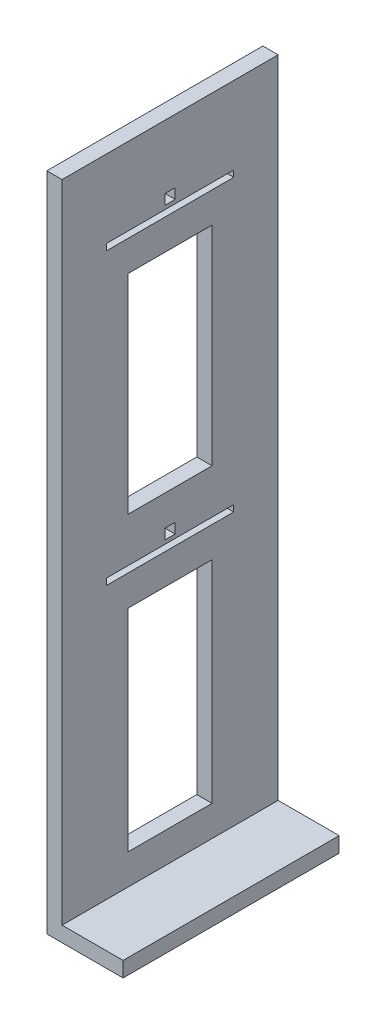
ISO-10303-21;
HEADER;
FILE_DESCRIPTION(('STEP AP214'),'2;1');
FILE_NAME('part.step','',(''),(''),'','','');
FILE_SCHEMA(('AUTOMOTIVE_DESIGN { 1 0 10303 214 1 1 1 1 }'));
ENDSEC;
DATA;
#1=APPLICATION_CONTEXT('core data for automotive mechanical design processes');
#2=APPLICATION_PROTOCOL_DEFINITION('international standard','automotive_design',2000,#1);
#3=PRODUCT_CONTEXT('',#1,'mechanical');
#4=PRODUCT('Part','Part','',(#3));
#5=PRODUCT_RELATED_PRODUCT_CATEGORY('part','',(#4));
#6=PRODUCT_DEFINITION_FORMATION('','',#4);
#7=PRODUCT_DEFINITION_CONTEXT('part definition',#1,'design');
#8=PRODUCT_DEFINITION('design','',#6,#7);
#9=PRODUCT_DEFINITION_SHAPE('','',#8);
#10=(LENGTH_UNIT() NAMED_UNIT(*) SI_UNIT(.MILLI.,.METRE.));
#11=(NAMED_UNIT(*) PLANE_ANGLE_UNIT() SI_UNIT($,.RADIAN.));
#12=(NAMED_UNIT(*) SI_UNIT($,.STERADIAN.) SOLID_ANGLE_UNIT());
#13=UNCERTAINTY_MEASURE_WITH_UNIT(LENGTH_MEASURE(1.E-05),#10,'distance_accuracy_value','');
#14=(GEOMETRIC_REPRESENTATION_CONTEXT(3) GLOBAL_UNCERTAINTY_ASSIGNED_CONTEXT((#13)) GLOBAL_UNIT_ASSIGNED_CONTEXT((#10,
#11,#12)) REPRESENTATION_CONTEXT('',''));
#15=CARTESIAN_POINT('',(0.,0.,0.));
#16=DIRECTION('',(0.,0.,1.));
#17=DIRECTION('',(1.,0.,0.));
#18=AXIS2_PLACEMENT_3D('',#15,#16,#17);
#19=CARTESIAN_POINT('',(-26.,1.2,-11.9444444444445));
#20=DIRECTION('',(1.,0.,0.));
#21=DIRECTION('',(0.,0.,-1.));
#22=AXIS2_PLACEMENT_3D('',#19,#20,#21);
#23=PLANE('',#22);
#24=DIRECTION('',(0.,0.,-1.));
#25=VECTOR('',#24,1.);
#26=CARTESIAN_POINT('',(-26.,43.,-0.144444444444462));
#27=LINE('',#26,#25);
#28=CARTESIAN_POINT('',(-26.,43.,-0.144444444444462));
#29=VERTEX_POINT('',#28);
#30=CARTESIAN_POINT('',(-26.,43.,-6.74444444444446));
#31=VERTEX_POINT('',#30);
#32=EDGE_CURVE('E267',#29,#31,#27,.T.);
#33=ORIENTED_EDGE('',*,*,#32,.F.);
#34=DIRECTION('',(0.,1.,0.));
#35=VECTOR('',#34,1.);
#36=CARTESIAN_POINT('',(-26.,43.,-0.144444444444462));
#37=LINE('',#36,#35);
#38=CARTESIAN_POINT('',(-26.,26.6,-0.144444444444464));
#39=VERTEX_POINT('',#38);
#40=EDGE_CURVE('E281',#39,#29,#37,.T.);
#41=ORIENTED_EDGE('',*,*,#40,.F.);
#42=DIRECTION('',(0.,0.,1.));
#43=VECTOR('',#42,1.);
#44=CARTESIAN_POINT('',(-26.,26.6,-0.144444444444464));
#45=LINE('',#44,#43);
#46=CARTESIAN_POINT('',(-26.,26.6,-6.74444444444446));
#47=VERTEX_POINT('',#46);
#48=EDGE_CURVE('E273',#47,#39,#45,.T.);
#49=ORIENTED_EDGE('',*,*,#48,.F.);
#50=DIRECTION('',(0.,-1.,0.));
#51=VECTOR('',#50,1.);
#52=CARTESIAN_POINT('',(-26.,43.,-6.74444444444446));
#53=LINE('',#52,#51);
#54=EDGE_CURVE('E264',#31,#47,#53,.T.);
#55=ORIENTED_EDGE('',*,*,#54,.F.);
#56=EDGE_LOOP('',(#33,#41,#49,#55));
#57=FACE_BOUND('',#56,.T.);
#58=DIRECTION('',(0.,0.,-1.));
#59=VECTOR('',#58,1.);
#60=CARTESIAN_POINT('',(-26.,20.2,-0.144444444444465));
#61=LINE('',#60,#59);
#62=CARTESIAN_POINT('',(-26.,20.2,-0.144444444444465));
#63=VERTEX_POINT('',#62);
#64=CARTESIAN_POINT('',(-26.,20.2,-6.74444444444447));
#65=VERTEX_POINT('',#64);
#66=EDGE_CURVE('E313',#63,#65,#61,.T.);
#67=ORIENTED_EDGE('',*,*,#66,.F.);
#68=DIRECTION('',(0.,1.,0.));
#69=VECTOR('',#68,1.);
#70=CARTESIAN_POINT('',(-26.,20.2,-0.144444444444465));
#71=LINE('',#70,#69);
#72=CARTESIAN_POINT('',(-26.,3.6,-0.144444444444467));
#73=VERTEX_POINT('',#72);
#74=EDGE_CURVE('E302',#73,#63,#71,.T.);
#75=ORIENTED_EDGE('',*,*,#74,.F.);
#76=DIRECTION('',(0.,0.,1.));
#77=VECTOR('',#76,1.);
#78=CARTESIAN_POINT('',(-26.,3.6,-0.144444444444467));
#79=LINE('',#78,#77);
#80=CARTESIAN_POINT('',(-26.,3.6,-6.74444444444447));
#81=VERTEX_POINT('',#80);
#82=EDGE_CURVE('E294',#81,#73,#79,.T.);
#83=ORIENTED_EDGE('',*,*,#82,.F.);
#84=DIRECTION('',(0.,-1.,0.));
#85=VECTOR('',#84,1.);
#86=CARTESIAN_POINT('',(-26.,20.2,-6.74444444444447));
#87=LINE('',#86,#85);
#88=EDGE_CURVE('E277',#65,#81,#87,.T.);
#89=ORIENTED_EDGE('',*,*,#88,.F.);
#90=EDGE_LOOP('',(#67,#75,#83,#89));
#91=FACE_BOUND('',#90,.T.);
#92=DIRECTION('',(0.,0.,1.));
#93=VECTOR('',#92,1.);
#94=CARTESIAN_POINT('',(-26.,46.2,-3.04444444444446));
#95=LINE('',#94,#93);
#96=CARTESIAN_POINT('',(-26.,46.2,-3.84444444444446));
#97=VERTEX_POINT('',#96);
#98=CARTESIAN_POINT('',(-26.,46.2,-3.04444444444446));
#99=VERTEX_POINT('',#98);
#100=EDGE_CURVE('E359',#97,#99,#95,.T.);
#101=ORIENTED_EDGE('',*,*,#100,.F.);
#102=DIRECTION('',(0.,-1.,0.));
#103=VECTOR('',#102,1.);
#104=CARTESIAN_POINT('',(-26.,46.2,-3.84444444444446));
#105=LINE('',#104,#103);
#106=CARTESIAN_POINT('',(-26.,47.,-3.84444444444446));
#107=VERTEX_POINT('',#106);
#108=EDGE_CURVE('E348',#107,#97,#105,.T.);
#109=ORIENTED_EDGE('',*,*,#108,.F.);
#110=DIRECTION('',(0.,0.,-1.));
#111=VECTOR('',#110,1.);
#112=CARTESIAN_POINT('',(-26.,47.,-3.04444444444446));
#113=LINE('',#112,#111);
#114=CARTESIAN_POINT('',(-26.,47.,-3.04444444444446));
#115=VERTEX_POINT('',#114);
#116=EDGE_CURVE('E340',#115,#107,#113,.T.);
#117=ORIENTED_EDGE('',*,*,#116,.F.);
#118=DIRECTION('',(0.,1.,0.));
#119=VECTOR('',#118,1.);
#120=CARTESIAN_POINT('',(-26.,46.2,-3.04444444444446));
#121=LINE('',#120,#119);
#122=EDGE_CURVE('E362',#99,#115,#121,.T.);
#123=ORIENTED_EDGE('',*,*,#122,.F.);
#124=EDGE_LOOP('',(#101,#109,#117,#123));
#125=FACE_BOUND('',#124,.T.);
#126=DIRECTION('',(0.,0.,-1.));
#127=VECTOR('',#126,1.);
#128=CARTESIAN_POINT('',(-26.,23.1,1.55555555555554));
#129=LINE('',#128,#127);
#130=CARTESIAN_POINT('',(-26.,23.1,1.55555555555554));
#131=VERTEX_POINT('',#130);
#132=CARTESIAN_POINT('',(-26.,23.1,-8.44444444444446));
#133=VERTEX_POINT('',#132);
#134=EDGE_CURVE('E382',#131,#133,#129,.T.);
#135=ORIENTED_EDGE('',*,*,#134,.F.);
#136=DIRECTION('',(0.,1.,0.));
#137=VECTOR('',#136,1.);
#138=CARTESIAN_POINT('',(-26.,23.1,1.55555555555554));
#139=LINE('',#138,#137);
#140=CARTESIAN_POINT('',(-26.,22.6,1.55555555555554));
#141=VERTEX_POINT('',#140);
#142=EDGE_CURVE('E371',#141,#131,#139,.T.);
#143=ORIENTED_EDGE('',*,*,#142,.F.);
#144=DIRECTION('',(0.,0.,1.));
#145=VECTOR('',#144,1.);
#146=CARTESIAN_POINT('',(-26.,22.6,1.55555555555554));
#147=LINE('',#146,#145);
#148=CARTESIAN_POINT('',(-26.,22.6,-8.44444444444446));
#149=VERTEX_POINT('',#148);
#150=EDGE_CURVE('E339',#149,#141,#147,.T.);
#151=ORIENTED_EDGE('',*,*,#150,.F.);
#152=DIRECTION('',(0.,-1.,0.));
#153=VECTOR('',#152,1.);
#154=CARTESIAN_POINT('',(-26.,23.1,-8.44444444444446));
#155=LINE('',#154,#153);
#156=EDGE_CURVE('E344',#133,#149,#155,.T.);
#157=ORIENTED_EDGE('',*,*,#156,.F.);
#158=EDGE_LOOP('',(#135,#143,#151,#157));
#159=FACE_BOUND('',#158,.T.);
#160=DIRECTION('',(0.,0.,-1.));
#161=VECTOR('',#160,1.);
#162=CARTESIAN_POINT('',(-26.,45.9,1.55555555555554));
#163=LINE('',#162,#161);
#164=CARTESIAN_POINT('',(-26.,45.9,1.55555555555554));
#165=VERTEX_POINT('',#164);
#166=CARTESIAN_POINT('',(-26.,45.9,-8.44444444444446));
#167=VERTEX_POINT('',#166);
#168=EDGE_CURVE('E334',#165,#167,#163,.T.);
#169=ORIENTED_EDGE('',*,*,#168,.F.);
#170=DIRECTION('',(0.,1.,0.));
#171=VECTOR('',#170,1.);
#172=CARTESIAN_POINT('',(-26.,45.9,1.55555555555554));
#173=LINE('',#172,#171);
#174=CARTESIAN_POINT('',(-26.,45.4,1.55555555555554));
#175=VERTEX_POINT('',#174);
#176=EDGE_CURVE('E323',#175,#165,#173,.T.);
#177=ORIENTED_EDGE('',*,*,#176,.F.);
#178=DIRECTION('',(0.,0.,1.));
#179=VECTOR('',#178,1.);
#180=CARTESIAN_POINT('',(-26.,45.4,1.55555555555554));
#181=LINE('',#180,#179);
#182=CARTESIAN_POINT('',(-26.,45.4,-8.44444444444446));
#183=VERTEX_POINT('',#182);
#184=EDGE_CURVE('E272',#183,#175,#181,.T.);
#185=ORIENTED_EDGE('',*,*,#184,.F.);
#186=DIRECTION('',(0.,-1.,0.));
#187=VECTOR('',#186,1.);
#188=CARTESIAN_POINT('',(-26.,45.9,-8.44444444444446));
#189=LINE('',#188,#187);
#190=EDGE_CURVE('E337',#167,#183,#189,.T.);
#191=ORIENTED_EDGE('',*,*,#190,.F.);
#192=EDGE_LOOP('',(#169,#177,#185,#191));
#193=FACE_BOUND('',#192,.T.);
#194=DIRECTION('',(0.,0.,1.));
#195=VECTOR('',#194,1.);
#196=CARTESIAN_POINT('',(-26.,23.4,-3.04444444444446));
#197=LINE('',#196,#195);
#198=CARTESIAN_POINT('',(-26.,23.4,-3.84444444444446));
#199=VERTEX_POINT('',#198);
#200=CARTESIAN_POINT('',(-26.,23.4,-3.04444444444446));
#201=VERTEX_POINT('',#200);
#202=EDGE_CURVE('E387',#199,#201,#197,.T.);
#203=ORIENTED_EDGE('',*,*,#202,.F.);
#204=DIRECTION('',(0.,-1.,0.));
#205=VECTOR('',#204,1.);
#206=CARTESIAN_POINT('',(-26.,23.4,-3.84444444444446));
#207=LINE('',#206,#205);
#208=CARTESIAN_POINT('',(-26.,24.2,-3.84444444444446));
#209=VERTEX_POINT('',#208);
#210=EDGE_CURVE('E390',#209,#199,#207,.T.);
#211=ORIENTED_EDGE('',*,*,#210,.F.);
#212=DIRECTION('',(0.,0.,-1.));
#213=VECTOR('',#212,1.);
#214=CARTESIAN_POINT('',(-26.,24.2,-3.04444444444446));
#215=LINE('',#214,#213);
#216=CARTESIAN_POINT('',(-26.,24.2,-3.04444444444446));
#217=VERTEX_POINT('',#216);
#218=EDGE_CURVE('E397',#217,#209,#215,.T.);
#219=ORIENTED_EDGE('',*,*,#218,.F.);
#220=DIRECTION('',(0.,1.,0.));
#221=VECTOR('',#220,1.);
#222=CARTESIAN_POINT('',(-26.,23.4,-3.04444444444446));
#223=LINE('',#222,#221);
#224=EDGE_CURVE('E364',#201,#217,#223,.T.);
#225=ORIENTED_EDGE('',*,*,#224,.F.);
#226=EDGE_LOOP('',(#203,#211,#219,#225));
#227=FACE_BOUND('',#226,.T.);
#228=DIRECTION('',(0.,-1.,0.));
#229=VECTOR('',#228,1.);
#230=CARTESIAN_POINT('',(-26.,1.2,5.05555555555554));
#231=LINE('',#230,#229);
#232=CARTESIAN_POINT('',(-26.,52.,5.05555555555554));
#233=VERTEX_POINT('',#232);
#234=CARTESIAN_POINT('',(-26.,0.,5.05555555555554));
#235=VERTEX_POINT('',#234);
#236=EDGE_CURVE('E11',#233,#235,#231,.T.);
#237=ORIENTED_EDGE('',*,*,#236,.F.);
#238=DIRECTION('',(0.,0.,1.));
#239=VECTOR('',#238,1.);
#240=CARTESIAN_POINT('',(-26.,52.,5.05555555555554));
#241=LINE('',#240,#239);
#242=CARTESIAN_POINT('',(-26.,52.,-11.9444444444445));
#243=VERTEX_POINT('',#242);
#244=EDGE_CURVE('E262',#243,#233,#241,.T.);
#245=ORIENTED_EDGE('',*,*,#244,.F.);
#246=DIRECTION('',(0.,-1.,0.));
#247=VECTOR('',#246,1.);
#248=CARTESIAN_POINT('',(-26.,1.2,-11.9444444444445));
#249=LINE('',#248,#247);
#250=CARTESIAN_POINT('',(-26.,0.,-11.9444444444445));
#251=VERTEX_POINT('',#250);
#252=EDGE_CURVE('E415',#243,#251,#249,.T.);
#253=ORIENTED_EDGE('',*,*,#252,.T.);
#254=DIRECTION('',(0.,0.,1.));
#255=VECTOR('',#254,1.);
#256=CARTESIAN_POINT('',(-26.,0.,-11.9444444444445));
#257=LINE('',#256,#255);
#258=EDGE_CURVE('E408',#251,#235,#257,.T.);
#259=ORIENTED_EDGE('',*,*,#258,.T.);
#260=EDGE_LOOP('',(#237,#245,#253,#259));
#261=FACE_BOUND('',#260,.T.);
#262=ADVANCED_FACE('F43',(#57,#91,#125,#159,#193,#227,#261),#23,.F.);
#263=CARTESIAN_POINT('',(-26.,1.2,5.05555555555554));
#264=DIRECTION('',(0.,0.,-1.));
#265=DIRECTION('',(-1.,0.,0.));
#266=AXIS2_PLACEMENT_3D('',#263,#264,#265);
#267=PLANE('',#266);
#268=DIRECTION('',(1.,0.,0.));
#269=VECTOR('',#268,1.);
#270=CARTESIAN_POINT('',(-26.,1.2,5.05555555555554));
#271=LINE('',#270,#269);
#272=CARTESIAN_POINT('',(-24.8,1.2,5.05555555555554));
#273=VERTEX_POINT('',#272);
#274=CARTESIAN_POINT('',(-20.,1.2,5.05555555555554));
#275=VERTEX_POINT('',#274);
#276=EDGE_CURVE('E256',#273,#275,#271,.T.);
#277=ORIENTED_EDGE('',*,*,#276,.F.);
#278=DIRECTION('',(0.,1.,0.));
#279=VECTOR('',#278,1.);
#280=CARTESIAN_POINT('',(-24.8,-15.8188131196038,5.05555555555554));
#281=LINE('',#280,#279);
#282=CARTESIAN_POINT('',(-24.8,52.,5.05555555555554));
#283=VERTEX_POINT('',#282);
#284=EDGE_CURVE('E243',#273,#283,#281,.T.);
#285=ORIENTED_EDGE('',*,*,#284,.T.);
#286=DIRECTION('',(1.,0.,0.));
#287=VECTOR('',#286,1.);
#288=CARTESIAN_POINT('',(-26.001,52.,5.05555555555554));
#289=LINE('',#288,#287);
#290=EDGE_CURVE('E253',#233,#283,#289,.T.);
#291=ORIENTED_EDGE('',*,*,#290,.F.);
#292=ORIENTED_EDGE('',*,*,#236,.T.);
#293=DIRECTION('',(1.,0.,0.));
#294=VECTOR('',#293,1.);
#295=CARTESIAN_POINT('',(-26.,0.,5.05555555555554));
#296=LINE('',#295,#294);
#297=CARTESIAN_POINT('',(-20.,0.,5.05555555555554));
#298=VERTEX_POINT('',#297);
#299=EDGE_CURVE('E418',#235,#298,#296,.T.);
#300=ORIENTED_EDGE('',*,*,#299,.T.);
#301=DIRECTION('',(0.,-1.,0.));
#302=VECTOR('',#301,1.);
#303=CARTESIAN_POINT('',(-20.,1.2,5.05555555555554));
#304=LINE('',#303,#302);
#305=EDGE_CURVE('E50',#275,#298,#304,.T.);
#306=ORIENTED_EDGE('',*,*,#305,.F.);
#307=EDGE_LOOP('',(#277,#285,#291,#292,#300,#306));
#308=FACE_BOUND('',#307,.T.);
#309=ADVANCED_FACE('F252',(#308),#267,.F.);
#310=CARTESIAN_POINT('',(-20.,1.2,-11.9444444444445));
#311=DIRECTION('',(-1.,0.,0.));
#312=DIRECTION('',(0.,0.,1.));
#313=AXIS2_PLACEMENT_3D('',#310,#311,#312);
#314=PLANE('',#313);
#315=DIRECTION('',(0.,0.,-1.));
#316=VECTOR('',#315,1.);
#317=CARTESIAN_POINT('',(-20.,0.,-11.9444444444445));
#318=LINE('',#317,#316);
#319=CARTESIAN_POINT('',(-20.,0.,-11.9444444444445));
#320=VERTEX_POINT('',#319);
#321=EDGE_CURVE('E420',#298,#320,#318,.T.);
#322=ORIENTED_EDGE('',*,*,#321,.T.);
#323=DIRECTION('',(0.,-1.,0.));
#324=VECTOR('',#323,1.);
#325=CARTESIAN_POINT('',(-20.,1.2,-11.9444444444445));
#326=LINE('',#325,#324);
#327=CARTESIAN_POINT('',(-20.,1.2,-11.9444444444445));
#328=VERTEX_POINT('',#327);
#329=EDGE_CURVE('E425',#328,#320,#326,.T.);
#330=ORIENTED_EDGE('',*,*,#329,.F.);
#331=DIRECTION('',(0.,0.,-1.));
#332=VECTOR('',#331,1.);
#333=CARTESIAN_POINT('',(-20.,1.2,-11.9444444444445));
#334=LINE('',#333,#332);
#335=EDGE_CURVE('E410',#275,#328,#334,.T.);
#336=ORIENTED_EDGE('',*,*,#335,.F.);
#337=ORIENTED_EDGE('',*,*,#305,.T.);
#338=EDGE_LOOP('',(#322,#330,#336,#337));
#339=FACE_BOUND('',#338,.T.);
#340=ADVANCED_FACE('F431',(#339),#314,.F.);
#341=CARTESIAN_POINT('',(-26.,1.2,-11.9444444444445));
#342=DIRECTION('',(0.,0.,1.));
#343=DIRECTION('',(1.,0.,0.));
#344=AXIS2_PLACEMENT_3D('',#341,#342,#343);
#345=PLANE('',#344);
#346=DIRECTION('',(1.,0.,0.));
#347=VECTOR('',#346,1.);
#348=CARTESIAN_POINT('',(-26.001,52.,-11.9444444444445));
#349=LINE('',#348,#347);
#350=CARTESIAN_POINT('',(-24.8,52.,-11.9444444444445));
#351=VERTEX_POINT('',#350);
#352=EDGE_CURVE('E263',#243,#351,#349,.T.);
#353=ORIENTED_EDGE('',*,*,#352,.T.);
#354=DIRECTION('',(0.,1.,0.));
#355=VECTOR('',#354,1.);
#356=CARTESIAN_POINT('',(-24.8,-15.8188131196038,-11.9444444444445));
#357=LINE('',#356,#355);
#358=CARTESIAN_POINT('',(-24.8,1.2,-11.9444444444445));
#359=VERTEX_POINT('',#358);
#360=EDGE_CURVE('E245',#359,#351,#357,.T.);
#361=ORIENTED_EDGE('',*,*,#360,.F.);
#362=DIRECTION('',(-1.,0.,0.));
#363=VECTOR('',#362,1.);
#364=CARTESIAN_POINT('',(-26.,1.2,-11.9444444444445));
#365=LINE('',#364,#363);
#366=EDGE_CURVE('E413',#328,#359,#365,.T.);
#367=ORIENTED_EDGE('',*,*,#366,.F.);
#368=ORIENTED_EDGE('',*,*,#329,.T.);
#369=DIRECTION('',(-1.,0.,0.));
#370=VECTOR('',#369,1.);
#371=CARTESIAN_POINT('',(-26.,0.,-11.9444444444445));
#372=LINE('',#371,#370);
#373=EDGE_CURVE('E411',#320,#251,#372,.T.);
#374=ORIENTED_EDGE('',*,*,#373,.T.);
#375=ORIENTED_EDGE('',*,*,#252,.F.);
#376=EDGE_LOOP('',(#353,#361,#367,#368,#374,#375));
#377=FACE_BOUND('',#376,.T.);
#378=ADVANCED_FACE('F440',(#377),#345,.F.);
#379=CARTESIAN_POINT('',(0.,1.2,0.));
#380=DIRECTION('',(0.,1.,0.));
#381=DIRECTION('',(0.,0.,1.));
#382=AXIS2_PLACEMENT_3D('',#379,#380,#381);
#383=PLANE('',#382);
#384=ORIENTED_EDGE('',*,*,#366,.T.);
#385=DIRECTION('',(0.,0.,-1.));
#386=VECTOR('',#385,1.);
#387=CARTESIAN_POINT('',(-24.8,1.2,5.05555555555554));
#388=LINE('',#387,#386);
#389=EDGE_CURVE('E258',#273,#359,#388,.T.);
#390=ORIENTED_EDGE('',*,*,#389,.F.);
#391=ORIENTED_EDGE('',*,*,#276,.T.);
#392=ORIENTED_EDGE('',*,*,#335,.T.);
#393=EDGE_LOOP('',(#384,#390,#391,#392));
#394=FACE_BOUND('',#393,.T.);
#395=ADVANCED_FACE('F443',(#394),#383,.T.);
#396=CARTESIAN_POINT('',(0.,0.,0.));
#397=DIRECTION('',(0.,1.,0.));
#398=DIRECTION('',(0.,0.,1.));
#399=AXIS2_PLACEMENT_3D('',#396,#397,#398);
#400=PLANE('',#399);
#401=ORIENTED_EDGE('',*,*,#258,.F.);
#402=ORIENTED_EDGE('',*,*,#373,.F.);
#403=ORIENTED_EDGE('',*,*,#321,.F.);
#404=ORIENTED_EDGE('',*,*,#299,.F.);
#405=EDGE_LOOP('',(#401,#402,#403,#404));
#406=FACE_BOUND('',#405,.T.);
#407=ADVANCED_FACE('F437',(#406),#400,.F.);
#408=CARTESIAN_POINT('',(-26.001,23.4,-3.84444444444446));
#409=DIRECTION('',(0.,0.,-1.));
#410=DIRECTION('',(-1.,0.,0.));
#411=AXIS2_PLACEMENT_3D('',#408,#409,#410);
#412=PLANE('',#411);
#413=DIRECTION('',(1.,0.,0.));
#414=VECTOR('',#413,1.);
#415=CARTESIAN_POINT('',(-26.001,23.4,-3.84444444444446));
#416=LINE('',#415,#414);
#417=CARTESIAN_POINT('',(-24.8,23.4,-3.84444444444446));
#418=VERTEX_POINT('',#417);
#419=EDGE_CURVE('E394',#199,#418,#416,.T.);
#420=ORIENTED_EDGE('',*,*,#419,.T.);
#421=DIRECTION('',(0.,1.,0.));
#422=VECTOR('',#421,1.);
#423=CARTESIAN_POINT('',(-24.8,23.4,-3.84444444444446));
#424=LINE('',#423,#422);
#425=CARTESIAN_POINT('',(-24.8,24.2,-3.84444444444446));
#426=VERTEX_POINT('',#425);
#427=EDGE_CURVE('E298',#418,#426,#424,.T.);
#428=ORIENTED_EDGE('',*,*,#427,.T.);
#429=DIRECTION('',(1.,0.,0.));
#430=VECTOR('',#429,1.);
#431=CARTESIAN_POINT('',(-26.001,24.2,-3.84444444444446));
#432=LINE('',#431,#430);
#433=EDGE_CURVE('E393',#209,#426,#432,.T.);
#434=ORIENTED_EDGE('',*,*,#433,.F.);
#435=ORIENTED_EDGE('',*,*,#210,.T.);
#436=EDGE_LOOP('',(#420,#428,#434,#435));
#437=FACE_BOUND('',#436,.T.);
#438=ADVANCED_FACE('F511',(#437),#412,.F.);
#439=CARTESIAN_POINT('',(-26.001,23.4,-3.04444444444446));
#440=DIRECTION('',(0.,-1.,0.));
#441=DIRECTION('',(0.,0.,-1.));
#442=AXIS2_PLACEMENT_3D('',#439,#440,#441);
#443=PLANE('',#442);
#444=DIRECTION('',(1.,0.,0.));
#445=VECTOR('',#444,1.);
#446=CARTESIAN_POINT('',(-26.001,23.4,-3.04444444444446));
#447=LINE('',#446,#445);
#448=CARTESIAN_POINT('',(-24.8,23.4,-3.04444444444446));
#449=VERTEX_POINT('',#448);
#450=EDGE_CURVE('E398',#201,#449,#447,.T.);
#451=ORIENTED_EDGE('',*,*,#450,.T.);
#452=DIRECTION('',(0.,0.,-1.));
#453=VECTOR('',#452,1.);
#454=CARTESIAN_POINT('',(-24.8,23.4,-3.04444444444446));
#455=LINE('',#454,#453);
#456=EDGE_CURVE('E507',#449,#418,#455,.T.);
#457=ORIENTED_EDGE('',*,*,#456,.T.);
#458=ORIENTED_EDGE('',*,*,#419,.F.);
#459=ORIENTED_EDGE('',*,*,#202,.T.);
#460=EDGE_LOOP('',(#451,#457,#458,#459));
#461=FACE_BOUND('',#460,.T.);
#462=ADVANCED_FACE('F522',(#461),#443,.F.);
#463=CARTESIAN_POINT('',(-26.001,23.4,-3.04444444444446));
#464=DIRECTION('',(0.,0.,1.));
#465=DIRECTION('',(1.,0.,0.));
#466=AXIS2_PLACEMENT_3D('',#463,#464,#465);
#467=PLANE('',#466);
#468=DIRECTION('',(1.,0.,0.));
#469=VECTOR('',#468,1.);
#470=CARTESIAN_POINT('',(-26.001,24.2,-3.04444444444446));
#471=LINE('',#470,#469);
#472=CARTESIAN_POINT('',(-24.8,24.2,-3.04444444444446));
#473=VERTEX_POINT('',#472);
#474=EDGE_CURVE('E401',#217,#473,#471,.T.);
#475=ORIENTED_EDGE('',*,*,#474,.T.);
#476=DIRECTION('',(0.,-1.,0.));
#477=VECTOR('',#476,1.);
#478=CARTESIAN_POINT('',(-24.8,23.4,-3.04444444444446));
#479=LINE('',#478,#477);
#480=EDGE_CURVE('E57',#473,#449,#479,.T.);
#481=ORIENTED_EDGE('',*,*,#480,.T.);
#482=ORIENTED_EDGE('',*,*,#450,.F.);
#483=ORIENTED_EDGE('',*,*,#224,.T.);
#484=EDGE_LOOP('',(#475,#481,#482,#483));
#485=FACE_BOUND('',#484,.T.);
#486=ADVANCED_FACE('F524',(#485),#467,.F.);
#487=CARTESIAN_POINT('',(-26.001,24.2,-3.04444444444446));
#488=DIRECTION('',(0.,1.,0.));
#489=DIRECTION('',(0.,0.,1.));
#490=AXIS2_PLACEMENT_3D('',#487,#488,#489);
#491=PLANE('',#490);
#492=ORIENTED_EDGE('',*,*,#433,.T.);
#493=DIRECTION('',(0.,0.,1.));
#494=VECTOR('',#493,1.);
#495=CARTESIAN_POINT('',(-24.8,24.2,-3.04444444444446));
#496=LINE('',#495,#494);
#497=EDGE_CURVE('E504',#426,#473,#496,.T.);
#498=ORIENTED_EDGE('',*,*,#497,.T.);
#499=ORIENTED_EDGE('',*,*,#474,.F.);
#500=ORIENTED_EDGE('',*,*,#218,.T.);
#501=EDGE_LOOP('',(#492,#498,#499,#500));
#502=FACE_BOUND('',#501,.T.);
#503=ADVANCED_FACE('F513',(#502),#491,.F.);
#504=CARTESIAN_POINT('',(-26.001,45.9,1.55555555555554));
#505=DIRECTION('',(0.,0.,1.));
#506=DIRECTION('',(1.,0.,0.));
#507=AXIS2_PLACEMENT_3D('',#504,#505,#506);
#508=PLANE('',#507);
#509=DIRECTION('',(1.,0.,0.));
#510=VECTOR('',#509,1.);
#511=CARTESIAN_POINT('',(-26.001,45.9,1.55555555555554));
#512=LINE('',#511,#510);
#513=CARTESIAN_POINT('',(-24.8,45.9,1.55555555555554));
#514=VERTEX_POINT('',#513);
#515=EDGE_CURVE('E319',#165,#514,#512,.T.);
#516=ORIENTED_EDGE('',*,*,#515,.T.);
#517=DIRECTION('',(0.,-1.,0.));
#518=VECTOR('',#517,1.);
#519=CARTESIAN_POINT('',(-24.8,45.9,1.55555555555554));
#520=LINE('',#519,#518);
#521=CARTESIAN_POINT('',(-24.8,45.4,1.55555555555554));
#522=VERTEX_POINT('',#521);
#523=EDGE_CURVE('E501',#514,#522,#520,.T.);
#524=ORIENTED_EDGE('',*,*,#523,.T.);
#525=DIRECTION('',(1.,0.,0.));
#526=VECTOR('',#525,1.);
#527=CARTESIAN_POINT('',(-26.001,45.4,1.55555555555554));
#528=LINE('',#527,#526);
#529=EDGE_CURVE('E320',#175,#522,#528,.T.);
#530=ORIENTED_EDGE('',*,*,#529,.F.);
#531=ORIENTED_EDGE('',*,*,#176,.T.);
#532=EDGE_LOOP('',(#516,#524,#530,#531));
#533=FACE_BOUND('',#532,.T.);
#534=ADVANCED_FACE('F531',(#533),#508,.F.);
#535=CARTESIAN_POINT('',(-26.001,45.9,1.55555555555554));
#536=DIRECTION('',(0.,1.,0.));
#537=DIRECTION('',(0.,0.,1.));
#538=AXIS2_PLACEMENT_3D('',#535,#536,#537);
#539=PLANE('',#538);
#540=DIRECTION('',(1.,0.,0.));
#541=VECTOR('',#540,1.);
#542=CARTESIAN_POINT('',(-26.001,45.9,-8.44444444444446));
#543=LINE('',#542,#541);
#544=CARTESIAN_POINT('',(-24.8,45.9,-8.44444444444446));
#545=VERTEX_POINT('',#544);
#546=EDGE_CURVE('E327',#167,#545,#543,.T.);
#547=ORIENTED_EDGE('',*,*,#546,.T.);
#548=DIRECTION('',(0.,0.,1.));
#549=VECTOR('',#548,1.);
#550=CARTESIAN_POINT('',(-24.8,45.9,1.55555555555554));
#551=LINE('',#550,#549);
#552=EDGE_CURVE('E498',#545,#514,#551,.T.);
#553=ORIENTED_EDGE('',*,*,#552,.T.);
#554=ORIENTED_EDGE('',*,*,#515,.F.);
#555=ORIENTED_EDGE('',*,*,#168,.T.);
#556=EDGE_LOOP('',(#547,#553,#554,#555));
#557=FACE_BOUND('',#556,.T.);
#558=ADVANCED_FACE('F561',(#557),#539,.F.);
#559=CARTESIAN_POINT('',(-26.001,45.9,-8.44444444444446));
#560=DIRECTION('',(0.,0.,-1.));
#561=DIRECTION('',(-1.,0.,0.));
#562=AXIS2_PLACEMENT_3D('',#559,#560,#561);
#563=PLANE('',#562);
#564=DIRECTION('',(1.,0.,0.));
#565=VECTOR('',#564,1.);
#566=CARTESIAN_POINT('',(-26.001,45.4,-8.44444444444446));
#567=LINE('',#566,#565);
#568=CARTESIAN_POINT('',(-24.8,45.4,-8.44444444444446));
#569=VERTEX_POINT('',#568);
#570=EDGE_CURVE('E324',#183,#569,#567,.T.);
#571=ORIENTED_EDGE('',*,*,#570,.T.);
#572=DIRECTION('',(0.,1.,0.));
#573=VECTOR('',#572,1.);
#574=CARTESIAN_POINT('',(-24.8,45.9,-8.44444444444446));
#575=LINE('',#574,#573);
#576=EDGE_CURVE('E65',#569,#545,#575,.T.);
#577=ORIENTED_EDGE('',*,*,#576,.T.);
#578=ORIENTED_EDGE('',*,*,#546,.F.);
#579=ORIENTED_EDGE('',*,*,#190,.T.);
#580=EDGE_LOOP('',(#571,#577,#578,#579));
#581=FACE_BOUND('',#580,.T.);
#582=ADVANCED_FACE('F567',(#581),#563,.F.);
#583=CARTESIAN_POINT('',(-26.001,45.4,1.55555555555554));
#584=DIRECTION('',(0.,-1.,0.));
#585=DIRECTION('',(0.,0.,-1.));
#586=AXIS2_PLACEMENT_3D('',#583,#584,#585);
#587=PLANE('',#586);
#588=ORIENTED_EDGE('',*,*,#529,.T.);
#589=DIRECTION('',(0.,0.,-1.));
#590=VECTOR('',#589,1.);
#591=CARTESIAN_POINT('',(-24.8,45.4,1.55555555555554));
#592=LINE('',#591,#590);
#593=EDGE_CURVE('E495',#522,#569,#592,.T.);
#594=ORIENTED_EDGE('',*,*,#593,.T.);
#595=ORIENTED_EDGE('',*,*,#570,.F.);
#596=ORIENTED_EDGE('',*,*,#184,.T.);
#597=EDGE_LOOP('',(#588,#594,#595,#596));
#598=FACE_BOUND('',#597,.T.);
#599=ADVANCED_FACE('F565',(#598),#587,.F.);
#600=CARTESIAN_POINT('',(-26.001,23.1,1.55555555555554));
#601=DIRECTION('',(0.,0.,1.));
#602=DIRECTION('',(0.,-1.,0.));
#603=AXIS2_PLACEMENT_3D('',#600,#601,#602);
#604=PLANE('',#603);
#605=DIRECTION('',(1.,0.,0.));
#606=VECTOR('',#605,1.);
#607=CARTESIAN_POINT('',(-26.001,23.1,1.55555555555554));
#608=LINE('',#607,#606);
#609=CARTESIAN_POINT('',(-24.8,23.1,1.55555555555554));
#610=VERTEX_POINT('',#609);
#611=EDGE_CURVE('E367',#131,#610,#608,.T.);
#612=ORIENTED_EDGE('',*,*,#611,.T.);
#613=DIRECTION('',(0.,-1.,0.));
#614=VECTOR('',#613,1.);
#615=CARTESIAN_POINT('',(-24.8,23.1,1.55555555555554));
#616=LINE('',#615,#614);
#617=CARTESIAN_POINT('',(-24.8,22.6,1.55555555555554));
#618=VERTEX_POINT('',#617);
#619=EDGE_CURVE('E492',#610,#618,#616,.T.);
#620=ORIENTED_EDGE('',*,*,#619,.T.);
#621=DIRECTION('',(1.,0.,0.));
#622=VECTOR('',#621,1.);
#623=CARTESIAN_POINT('',(-26.001,22.6,1.55555555555554));
#624=LINE('',#623,#622);
#625=EDGE_CURVE('E368',#141,#618,#624,.T.);
#626=ORIENTED_EDGE('',*,*,#625,.F.);
#627=ORIENTED_EDGE('',*,*,#142,.T.);
#628=EDGE_LOOP('',(#612,#620,#626,#627));
#629=FACE_BOUND('',#628,.T.);
#630=ADVANCED_FACE('F574',(#629),#604,.F.);
#631=CARTESIAN_POINT('',(-26.001,23.1,1.55555555555554));
#632=DIRECTION('',(0.,1.,0.));
#633=DIRECTION('',(0.,0.,1.));
#634=AXIS2_PLACEMENT_3D('',#631,#632,#633);
#635=PLANE('',#634);
#636=DIRECTION('',(1.,0.,0.));
#637=VECTOR('',#636,1.);
#638=CARTESIAN_POINT('',(-26.001,23.1,-8.44444444444446));
#639=LINE('',#638,#637);
#640=CARTESIAN_POINT('',(-24.8,23.1,-8.44444444444446));
#641=VERTEX_POINT('',#640);
#642=EDGE_CURVE('E375',#133,#641,#639,.T.);
#643=ORIENTED_EDGE('',*,*,#642,.T.);
#644=DIRECTION('',(0.,0.,1.));
#645=VECTOR('',#644,1.);
#646=CARTESIAN_POINT('',(-24.8,23.1,1.55555555555554));
#647=LINE('',#646,#645);
#648=EDGE_CURVE('E489',#641,#610,#647,.T.);
#649=ORIENTED_EDGE('',*,*,#648,.T.);
#650=ORIENTED_EDGE('',*,*,#611,.F.);
#651=ORIENTED_EDGE('',*,*,#134,.T.);
#652=EDGE_LOOP('',(#643,#649,#650,#651));
#653=FACE_BOUND('',#652,.T.);
#654=ADVANCED_FACE('F599',(#653),#635,.F.);
#655=CARTESIAN_POINT('',(-26.001,23.1,-8.44444444444446));
#656=DIRECTION('',(0.,0.,-1.));
#657=DIRECTION('',(0.,1.,0.));
#658=AXIS2_PLACEMENT_3D('',#655,#656,#657);
#659=PLANE('',#658);
#660=DIRECTION('',(1.,0.,0.));
#661=VECTOR('',#660,1.);
#662=CARTESIAN_POINT('',(-26.001,22.6,-8.44444444444446));
#663=LINE('',#662,#661);
#664=CARTESIAN_POINT('',(-24.8,22.6,-8.44444444444446));
#665=VERTEX_POINT('',#664);
#666=EDGE_CURVE('E372',#149,#665,#663,.T.);
#667=ORIENTED_EDGE('',*,*,#666,.T.);
#668=DIRECTION('',(0.,1.,0.));
#669=VECTOR('',#668,1.);
#670=CARTESIAN_POINT('',(-24.8,23.1,-8.44444444444446));
#671=LINE('',#670,#669);
#672=EDGE_CURVE('E486',#665,#641,#671,.T.);
#673=ORIENTED_EDGE('',*,*,#672,.T.);
#674=ORIENTED_EDGE('',*,*,#642,.F.);
#675=ORIENTED_EDGE('',*,*,#156,.T.);
#676=EDGE_LOOP('',(#667,#673,#674,#675));
#677=FACE_BOUND('',#676,.T.);
#678=ADVANCED_FACE('F603',(#677),#659,.F.);
#679=CARTESIAN_POINT('',(-26.001,22.6,1.55555555555554));
#680=DIRECTION('',(0.,-1.,0.));
#681=DIRECTION('',(0.,0.,-1.));
#682=AXIS2_PLACEMENT_3D('',#679,#680,#681);
#683=PLANE('',#682);
#684=ORIENTED_EDGE('',*,*,#625,.T.);
#685=DIRECTION('',(0.,0.,-1.));
#686=VECTOR('',#685,1.);
#687=CARTESIAN_POINT('',(-24.8,22.6,1.55555555555554));
#688=LINE('',#687,#686);
#689=EDGE_CURVE('E483',#618,#665,#688,.T.);
#690=ORIENTED_EDGE('',*,*,#689,.T.);
#691=ORIENTED_EDGE('',*,*,#666,.F.);
#692=ORIENTED_EDGE('',*,*,#150,.T.);
#693=EDGE_LOOP('',(#684,#690,#691,#692));
#694=FACE_BOUND('',#693,.T.);
#695=ADVANCED_FACE('F583',(#694),#683,.F.);
#696=CARTESIAN_POINT('',(-26.001,46.2,-3.84444444444446));
#697=DIRECTION('',(0.,0.,-1.));
#698=DIRECTION('',(-1.,0.,0.));
#699=AXIS2_PLACEMENT_3D('',#696,#697,#698);
#700=PLANE('',#699);
#701=DIRECTION('',(1.,0.,0.));
#702=VECTOR('',#701,1.);
#703=CARTESIAN_POINT('',(-26.001,46.2,-3.84444444444446));
#704=LINE('',#703,#702);
#705=CARTESIAN_POINT('',(-24.8,46.2,-3.84444444444446));
#706=VERTEX_POINT('',#705);
#707=EDGE_CURVE('E343',#97,#706,#704,.T.);
#708=ORIENTED_EDGE('',*,*,#707,.T.);
#709=DIRECTION('',(0.,1.,0.));
#710=VECTOR('',#709,1.);
#711=CARTESIAN_POINT('',(-24.8,46.2,-3.84444444444446));
#712=LINE('',#711,#710);
#713=CARTESIAN_POINT('',(-24.8,47.,-3.84444444444446));
#714=VERTEX_POINT('',#713);
#715=EDGE_CURVE('E480',#706,#714,#712,.T.);
#716=ORIENTED_EDGE('',*,*,#715,.T.);
#717=DIRECTION('',(1.,0.,0.));
#718=VECTOR('',#717,1.);
#719=CARTESIAN_POINT('',(-26.001,47.,-3.84444444444446));
#720=LINE('',#719,#718);
#721=EDGE_CURVE('E345',#107,#714,#720,.T.);
#722=ORIENTED_EDGE('',*,*,#721,.F.);
#723=ORIENTED_EDGE('',*,*,#108,.T.);
#724=EDGE_LOOP('',(#708,#716,#722,#723));
#725=FACE_BOUND('',#724,.T.);
#726=ADVANCED_FACE('F579',(#725),#700,.F.);
#727=CARTESIAN_POINT('',(-26.001,46.2,-3.04444444444446));
#728=DIRECTION('',(0.,-1.,0.));
#729=DIRECTION('',(0.,0.,-1.));
#730=AXIS2_PLACEMENT_3D('',#727,#728,#729);
#731=PLANE('',#730);
#732=DIRECTION('',(1.,0.,0.));
#733=VECTOR('',#732,1.);
#734=CARTESIAN_POINT('',(-26.001,46.2,-3.04444444444446));
#735=LINE('',#734,#733);
#736=CARTESIAN_POINT('',(-24.8,46.2,-3.04444444444446));
#737=VERTEX_POINT('',#736);
#738=EDGE_CURVE('E352',#99,#737,#735,.T.);
#739=ORIENTED_EDGE('',*,*,#738,.T.);
#740=DIRECTION('',(0.,0.,-1.));
#741=VECTOR('',#740,1.);
#742=CARTESIAN_POINT('',(-24.8,46.2,-3.04444444444446));
#743=LINE('',#742,#741);
#744=EDGE_CURVE('E477',#737,#706,#743,.T.);
#745=ORIENTED_EDGE('',*,*,#744,.T.);
#746=ORIENTED_EDGE('',*,*,#707,.F.);
#747=ORIENTED_EDGE('',*,*,#100,.T.);
#748=EDGE_LOOP('',(#739,#745,#746,#747));
#749=FACE_BOUND('',#748,.T.);
#750=ADVANCED_FACE('F582',(#749),#731,.F.);
#751=CARTESIAN_POINT('',(-26.001,46.2,-3.04444444444446));
#752=DIRECTION('',(0.,0.,1.));
#753=DIRECTION('',(1.,0.,0.));
#754=AXIS2_PLACEMENT_3D('',#751,#752,#753);
#755=PLANE('',#754);
#756=DIRECTION('',(1.,0.,0.));
#757=VECTOR('',#756,1.);
#758=CARTESIAN_POINT('',(-26.001,47.,-3.04444444444446));
#759=LINE('',#758,#757);
#760=CARTESIAN_POINT('',(-24.8,47.,-3.04444444444446));
#761=VERTEX_POINT('',#760);
#762=EDGE_CURVE('E349',#115,#761,#759,.T.);
#763=ORIENTED_EDGE('',*,*,#762,.T.);
#764=DIRECTION('',(0.,-1.,0.));
#765=VECTOR('',#764,1.);
#766=CARTESIAN_POINT('',(-24.8,46.2,-3.04444444444446));
#767=LINE('',#766,#765);
#768=EDGE_CURVE('E474',#761,#737,#767,.T.);
#769=ORIENTED_EDGE('',*,*,#768,.T.);
#770=ORIENTED_EDGE('',*,*,#738,.F.);
#771=ORIENTED_EDGE('',*,*,#122,.T.);
#772=EDGE_LOOP('',(#763,#769,#770,#771));
#773=FACE_BOUND('',#772,.T.);
#774=ADVANCED_FACE('F589',(#773),#755,.F.);
#775=CARTESIAN_POINT('',(-26.001,47.,-3.04444444444446));
#776=DIRECTION('',(0.,1.,0.));
#777=DIRECTION('',(0.,0.,1.));
#778=AXIS2_PLACEMENT_3D('',#775,#776,#777);
#779=PLANE('',#778);
#780=ORIENTED_EDGE('',*,*,#721,.T.);
#781=DIRECTION('',(0.,0.,1.));
#782=VECTOR('',#781,1.);
#783=CARTESIAN_POINT('',(-24.8,47.,-3.04444444444446));
#784=LINE('',#783,#782);
#785=EDGE_CURVE('E471',#714,#761,#784,.T.);
#786=ORIENTED_EDGE('',*,*,#785,.T.);
#787=ORIENTED_EDGE('',*,*,#762,.F.);
#788=ORIENTED_EDGE('',*,*,#116,.T.);
#789=EDGE_LOOP('',(#780,#786,#787,#788));
#790=FACE_BOUND('',#789,.T.);
#791=ADVANCED_FACE('F585',(#790),#779,.F.);
#792=CARTESIAN_POINT('',(-26.001,20.2,-0.144444444444465));
#793=DIRECTION('',(0.,0.,1.));
#794=DIRECTION('',(0.,-1.,0.));
#795=AXIS2_PLACEMENT_3D('',#792,#793,#794);
#796=PLANE('',#795);
#797=DIRECTION('',(1.,0.,0.));
#798=VECTOR('',#797,1.);
#799=CARTESIAN_POINT('',(-26.001,20.2,-0.144444444444465));
#800=LINE('',#799,#798);
#801=CARTESIAN_POINT('',(-24.8,20.2,-0.144444444444465));
#802=VERTEX_POINT('',#801);
#803=EDGE_CURVE('E297',#63,#802,#800,.T.);
#804=ORIENTED_EDGE('',*,*,#803,.T.);
#805=DIRECTION('',(0.,-1.,0.));
#806=VECTOR('',#805,1.);
#807=CARTESIAN_POINT('',(-24.8,20.2,-0.144444444444465));
#808=LINE('',#807,#806);
#809=CARTESIAN_POINT('',(-24.8,3.6,-0.144444444444466));
#810=VERTEX_POINT('',#809);
#811=EDGE_CURVE('E468',#802,#810,#808,.T.);
#812=ORIENTED_EDGE('',*,*,#811,.T.);
#813=DIRECTION('',(1.,0.,0.));
#814=VECTOR('',#813,1.);
#815=CARTESIAN_POINT('',(-26.001,3.6,-0.144444444444467));
#816=LINE('',#815,#814);
#817=EDGE_CURVE('E299',#73,#810,#816,.T.);
#818=ORIENTED_EDGE('',*,*,#817,.F.);
#819=ORIENTED_EDGE('',*,*,#74,.T.);
#820=EDGE_LOOP('',(#804,#812,#818,#819));
#821=FACE_BOUND('',#820,.T.);
#822=ADVANCED_FACE('F588',(#821),#796,.F.);
#823=CARTESIAN_POINT('',(-26.001,20.2,-0.144444444444465));
#824=DIRECTION('',(0.,1.,0.));
#825=DIRECTION('',(0.,0.,1.));
#826=AXIS2_PLACEMENT_3D('',#823,#824,#825);
#827=PLANE('',#826);
#828=DIRECTION('',(1.,0.,0.));
#829=VECTOR('',#828,1.);
#830=CARTESIAN_POINT('',(-26.001,20.2,-6.74444444444447));
#831=LINE('',#830,#829);
#832=CARTESIAN_POINT('',(-24.8,20.2,-6.74444444444447));
#833=VERTEX_POINT('',#832);
#834=EDGE_CURVE('E306',#65,#833,#831,.T.);
#835=ORIENTED_EDGE('',*,*,#834,.T.);
#836=DIRECTION('',(0.,0.,1.));
#837=VECTOR('',#836,1.);
#838=CARTESIAN_POINT('',(-24.8,20.2,-0.144444444444465));
#839=LINE('',#838,#837);
#840=EDGE_CURVE('E465',#833,#802,#839,.T.);
#841=ORIENTED_EDGE('',*,*,#840,.T.);
#842=ORIENTED_EDGE('',*,*,#803,.F.);
#843=ORIENTED_EDGE('',*,*,#66,.T.);
#844=EDGE_LOOP('',(#835,#841,#842,#843));
#845=FACE_BOUND('',#844,.T.);
#846=ADVANCED_FACE('F642',(#845),#827,.F.);
#847=CARTESIAN_POINT('',(-26.001,20.2,-6.74444444444447));
#848=DIRECTION('',(0.,0.,-1.));
#849=DIRECTION('',(0.,1.,0.));
#850=AXIS2_PLACEMENT_3D('',#847,#848,#849);
#851=PLANE('',#850);
#852=DIRECTION('',(1.,0.,0.));
#853=VECTOR('',#852,1.);
#854=CARTESIAN_POINT('',(-26.001,3.6,-6.74444444444447));
#855=LINE('',#854,#853);
#856=CARTESIAN_POINT('',(-24.8,3.6,-6.74444444444447));
#857=VERTEX_POINT('',#856);
#858=EDGE_CURVE('E303',#81,#857,#855,.T.);
#859=ORIENTED_EDGE('',*,*,#858,.T.);
#860=DIRECTION('',(0.,1.,0.));
#861=VECTOR('',#860,1.);
#862=CARTESIAN_POINT('',(-24.8,20.2,-6.74444444444447));
#863=LINE('',#862,#861);
#864=EDGE_CURVE('E462',#857,#833,#863,.T.);
#865=ORIENTED_EDGE('',*,*,#864,.T.);
#866=ORIENTED_EDGE('',*,*,#834,.F.);
#867=ORIENTED_EDGE('',*,*,#88,.T.);
#868=EDGE_LOOP('',(#859,#865,#866,#867));
#869=FACE_BOUND('',#868,.T.);
#870=ADVANCED_FACE('F646',(#869),#851,.F.);
#871=CARTESIAN_POINT('',(-26.001,3.6,-0.144444444444467));
#872=DIRECTION('',(0.,-1.,0.));
#873=DIRECTION('',(0.,0.,-1.));
#874=AXIS2_PLACEMENT_3D('',#871,#872,#873);
#875=PLANE('',#874);
#876=ORIENTED_EDGE('',*,*,#817,.T.);
#877=DIRECTION('',(0.,0.,-1.));
#878=VECTOR('',#877,1.);
#879=CARTESIAN_POINT('',(-24.8,3.6,-0.144444444444467));
#880=LINE('',#879,#878);
#881=EDGE_CURVE('E459',#810,#857,#880,.T.);
#882=ORIENTED_EDGE('',*,*,#881,.T.);
#883=ORIENTED_EDGE('',*,*,#858,.F.);
#884=ORIENTED_EDGE('',*,*,#82,.T.);
#885=EDGE_LOOP('',(#876,#882,#883,#884));
#886=FACE_BOUND('',#885,.T.);
#887=ADVANCED_FACE('F628',(#886),#875,.F.);
#888=CARTESIAN_POINT('',(-26.001,43.,-0.144444444444462));
#889=DIRECTION('',(0.,0.,1.));
#890=DIRECTION('',(0.,-1.,0.));
#891=AXIS2_PLACEMENT_3D('',#888,#889,#890);
#892=PLANE('',#891);
#893=DIRECTION('',(1.,0.,0.));
#894=VECTOR('',#893,1.);
#895=CARTESIAN_POINT('',(-26.001,43.,-0.144444444444462));
#896=LINE('',#895,#894);
#897=CARTESIAN_POINT('',(-24.8,43.,-0.144444444444462));
#898=VERTEX_POINT('',#897);
#899=EDGE_CURVE('E276',#29,#898,#896,.T.);
#900=ORIENTED_EDGE('',*,*,#899,.T.);
#901=DIRECTION('',(0.,-1.,0.));
#902=VECTOR('',#901,1.);
#903=CARTESIAN_POINT('',(-24.8,43.,-0.144444444444462));
#904=LINE('',#903,#902);
#905=CARTESIAN_POINT('',(-24.8,26.6,-0.144444444444464));
#906=VERTEX_POINT('',#905);
#907=EDGE_CURVE('E456',#898,#906,#904,.T.);
#908=ORIENTED_EDGE('',*,*,#907,.T.);
#909=DIRECTION('',(1.,0.,0.));
#910=VECTOR('',#909,1.);
#911=CARTESIAN_POINT('',(-26.001,26.6,-0.144444444444464));
#912=LINE('',#911,#910);
#913=EDGE_CURVE('E278',#39,#906,#912,.T.);
#914=ORIENTED_EDGE('',*,*,#913,.F.);
#915=ORIENTED_EDGE('',*,*,#40,.T.);
#916=EDGE_LOOP('',(#900,#908,#914,#915));
#917=FACE_BOUND('',#916,.T.);
#918=ADVANCED_FACE('F624',(#917),#892,.F.);
#919=CARTESIAN_POINT('',(-26.001,43.,-0.144444444444462));
#920=DIRECTION('',(0.,1.,0.));
#921=DIRECTION('',(0.,0.,1.));
#922=AXIS2_PLACEMENT_3D('',#919,#920,#921);
#923=PLANE('',#922);
#924=DIRECTION('',(1.,0.,0.));
#925=VECTOR('',#924,1.);
#926=CARTESIAN_POINT('',(-26.001,43.,-6.74444444444446));
#927=LINE('',#926,#925);
#928=CARTESIAN_POINT('',(-24.8,43.,-6.74444444444446));
#929=VERTEX_POINT('',#928);
#930=EDGE_CURVE('E285',#31,#929,#927,.T.);
#931=ORIENTED_EDGE('',*,*,#930,.T.);
#932=DIRECTION('',(0.,0.,1.));
#933=VECTOR('',#932,1.);
#934=CARTESIAN_POINT('',(-24.8,43.,-0.144444444444462));
#935=LINE('',#934,#933);
#936=EDGE_CURVE('E453',#929,#898,#935,.T.);
#937=ORIENTED_EDGE('',*,*,#936,.T.);
#938=ORIENTED_EDGE('',*,*,#899,.F.);
#939=ORIENTED_EDGE('',*,*,#32,.T.);
#940=EDGE_LOOP('',(#931,#937,#938,#939));
#941=FACE_BOUND('',#940,.T.);
#942=ADVANCED_FACE('F627',(#941),#923,.F.);
#943=CARTESIAN_POINT('',(-26.001,43.,-6.74444444444446));
#944=DIRECTION('',(0.,0.,-1.));
#945=DIRECTION('',(0.,1.,0.));
#946=AXIS2_PLACEMENT_3D('',#943,#944,#945);
#947=PLANE('',#946);
#948=DIRECTION('',(1.,0.,0.));
#949=VECTOR('',#948,1.);
#950=CARTESIAN_POINT('',(-26.001,26.6,-6.74444444444446));
#951=LINE('',#950,#949);
#952=CARTESIAN_POINT('',(-24.8,26.6,-6.74444444444446));
#953=VERTEX_POINT('',#952);
#954=EDGE_CURVE('E282',#47,#953,#951,.T.);
#955=ORIENTED_EDGE('',*,*,#954,.T.);
#956=DIRECTION('',(0.,1.,0.));
#957=VECTOR('',#956,1.);
#958=CARTESIAN_POINT('',(-24.8,43.,-6.74444444444446));
#959=LINE('',#958,#957);
#960=EDGE_CURVE('E447',#953,#929,#959,.T.);
#961=ORIENTED_EDGE('',*,*,#960,.T.);
#962=ORIENTED_EDGE('',*,*,#930,.F.);
#963=ORIENTED_EDGE('',*,*,#54,.T.);
#964=EDGE_LOOP('',(#955,#961,#962,#963));
#965=FACE_BOUND('',#964,.T.);
#966=ADVANCED_FACE('F632',(#965),#947,.F.);
#967=CARTESIAN_POINT('',(-26.001,26.6,-0.144444444444464));
#968=DIRECTION('',(0.,-1.,0.));
#969=DIRECTION('',(0.,0.,-1.));
#970=AXIS2_PLACEMENT_3D('',#967,#968,#969);
#971=PLANE('',#970);
#972=ORIENTED_EDGE('',*,*,#913,.T.);
#973=DIRECTION('',(0.,0.,-1.));
#974=VECTOR('',#973,1.);
#975=CARTESIAN_POINT('',(-24.8,26.6,-0.144444444444464));
#976=LINE('',#975,#974);
#977=EDGE_CURVE('E444',#906,#953,#976,.T.);
#978=ORIENTED_EDGE('',*,*,#977,.T.);
#979=ORIENTED_EDGE('',*,*,#954,.F.);
#980=ORIENTED_EDGE('',*,*,#48,.T.);
#981=EDGE_LOOP('',(#972,#978,#979,#980));
#982=FACE_BOUND('',#981,.T.);
#983=ADVANCED_FACE('F621',(#982),#971,.F.);
#984=CARTESIAN_POINT('',(-26.001,52.,5.05555555555554));
#985=DIRECTION('',(0.,-1.,0.));
#986=DIRECTION('',(0.,0.,-1.));
#987=AXIS2_PLACEMENT_3D('',#984,#985,#986);
#988=PLANE('',#987);
#989=ORIENTED_EDGE('',*,*,#290,.T.);
#990=DIRECTION('',(0.,0.,1.));
#991=VECTOR('',#990,1.);
#992=CARTESIAN_POINT('',(-24.8,52.,5.05555555555554));
#993=LINE('',#992,#991);
#994=EDGE_CURVE('E238',#351,#283,#993,.T.);
#995=ORIENTED_EDGE('',*,*,#994,.F.);
#996=ORIENTED_EDGE('',*,*,#352,.F.);
#997=ORIENTED_EDGE('',*,*,#244,.T.);
#998=EDGE_LOOP('',(#989,#995,#996,#997));
#999=FACE_BOUND('',#998,.T.);
#1000=ADVANCED_FACE('F260',(#999),#988,.F.);
#1001=CARTESIAN_POINT('',(-24.8,-15.8188131196038,5.05555555555554));
#1002=DIRECTION('',(-1.,0.,0.));
#1003=DIRECTION('',(0.,0.,1.));
#1004=AXIS2_PLACEMENT_3D('',#1001,#1002,#1003);
#1005=PLANE('',#1004);
#1006=ORIENTED_EDGE('',*,*,#389,.T.);
#1007=ORIENTED_EDGE('',*,*,#360,.T.);
#1008=ORIENTED_EDGE('',*,*,#994,.T.);
#1009=ORIENTED_EDGE('',*,*,#284,.F.);
#1010=EDGE_LOOP('',(#1006,#1007,#1008,#1009));
#1011=FACE_BOUND('',#1010,.T.);
#1012=ORIENTED_EDGE('',*,*,#936,.F.);
#1013=ORIENTED_EDGE('',*,*,#960,.F.);
#1014=ORIENTED_EDGE('',*,*,#977,.F.);
#1015=ORIENTED_EDGE('',*,*,#907,.F.);
#1016=EDGE_LOOP('',(#1012,#1013,#1014,#1015));
#1017=FACE_BOUND('',#1016,.T.);
#1018=ORIENTED_EDGE('',*,*,#840,.F.);
#1019=ORIENTED_EDGE('',*,*,#864,.F.);
#1020=ORIENTED_EDGE('',*,*,#881,.F.);
#1021=ORIENTED_EDGE('',*,*,#811,.F.);
#1022=EDGE_LOOP('',(#1018,#1019,#1020,#1021));
#1023=FACE_BOUND('',#1022,.T.);
#1024=ORIENTED_EDGE('',*,*,#744,.F.);
#1025=ORIENTED_EDGE('',*,*,#768,.F.);
#1026=ORIENTED_EDGE('',*,*,#785,.F.);
#1027=ORIENTED_EDGE('',*,*,#715,.F.);
#1028=EDGE_LOOP('',(#1024,#1025,#1026,#1027));
#1029=FACE_BOUND('',#1028,.T.);
#1030=ORIENTED_EDGE('',*,*,#648,.F.);
#1031=ORIENTED_EDGE('',*,*,#672,.F.);
#1032=ORIENTED_EDGE('',*,*,#689,.F.);
#1033=ORIENTED_EDGE('',*,*,#619,.F.);
#1034=EDGE_LOOP('',(#1030,#1031,#1032,#1033));
#1035=FACE_BOUND('',#1034,.T.);
#1036=ORIENTED_EDGE('',*,*,#552,.F.);
#1037=ORIENTED_EDGE('',*,*,#576,.F.);
#1038=ORIENTED_EDGE('',*,*,#593,.F.);
#1039=ORIENTED_EDGE('',*,*,#523,.F.);
#1040=EDGE_LOOP('',(#1036,#1037,#1038,#1039));
#1041=FACE_BOUND('',#1040,.T.);
#1042=ORIENTED_EDGE('',*,*,#456,.F.);
#1043=ORIENTED_EDGE('',*,*,#480,.F.);
#1044=ORIENTED_EDGE('',*,*,#497,.F.);
#1045=ORIENTED_EDGE('',*,*,#427,.F.);
#1046=EDGE_LOOP('',(#1042,#1043,#1044,#1045));
#1047=FACE_BOUND('',#1046,.T.);
#1048=ADVANCED_FACE('F241',(#1011,#1017,#1023,#1029,#1035,#1041,#1047),#1005,.F.);
#1049=CLOSED_SHELL('',(#262,#309,#340,#378,#395,#407,#438,#462,#486,#503,#534,#558,#582,#599,
#630,#654,#678,#695,#726,#750,#774,#791,#822,#846,#870,#887,#918,#942,#966,#983,#1000,#1048));
#1050=MANIFOLD_SOLID_BREP('B2',#1049);
#1051=ADVANCED_BREP_SHAPE_REPRESENTATION('',(#18,#1050),#14);
#1052=SHAPE_DEFINITION_REPRESENTATION(#9,#1051);
ENDSEC;
END-ISO-10303-21;
